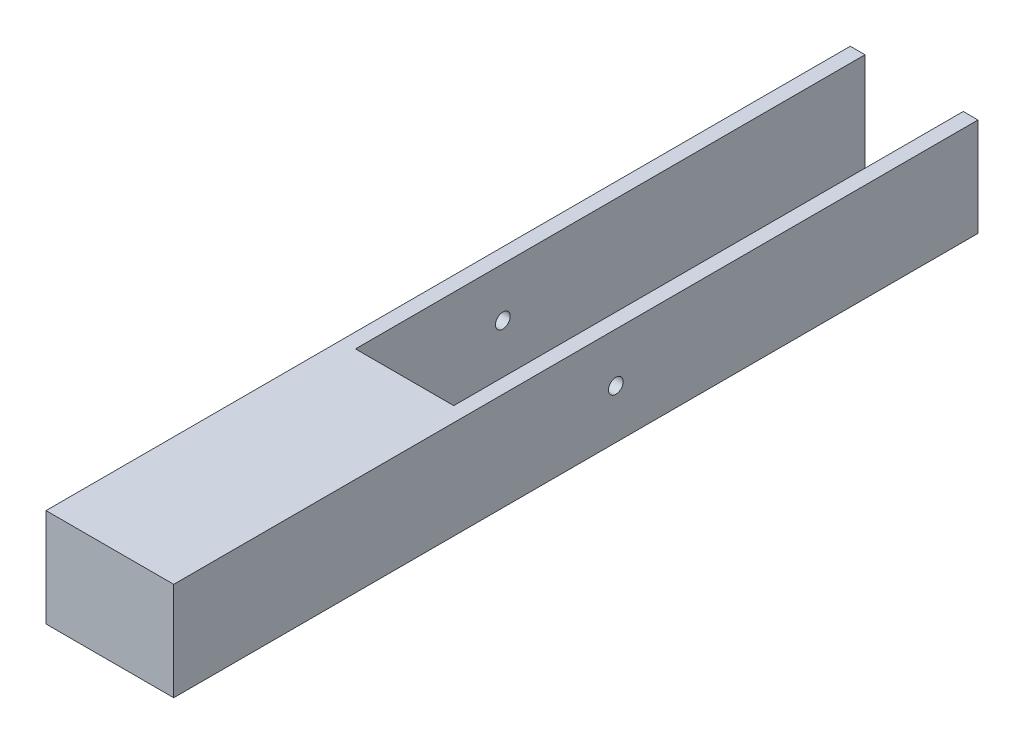
ISO-10303-21;
HEADER;
FILE_DESCRIPTION(('STEP AP214'),'2;1');
FILE_NAME('part.step','',(''),(''),'','','');
FILE_SCHEMA(('AUTOMOTIVE_DESIGN { 1 0 10303 214 1 1 1 1 }'));
ENDSEC;
DATA;
#1=APPLICATION_CONTEXT('core data for automotive mechanical design processes');
#2=APPLICATION_PROTOCOL_DEFINITION('international standard','automotive_design',2000,#1);
#3=PRODUCT_CONTEXT('',#1,'mechanical');
#4=PRODUCT('Part','Part','',(#3));
#5=PRODUCT_RELATED_PRODUCT_CATEGORY('part','',(#4));
#6=PRODUCT_DEFINITION_FORMATION('','',#4);
#7=PRODUCT_DEFINITION_CONTEXT('part definition',#1,'design');
#8=PRODUCT_DEFINITION('design','',#6,#7);
#9=PRODUCT_DEFINITION_SHAPE('','',#8);
#10=(LENGTH_UNIT() NAMED_UNIT(*) SI_UNIT(.MILLI.,.METRE.));
#11=(NAMED_UNIT(*) PLANE_ANGLE_UNIT() SI_UNIT($,.RADIAN.));
#12=(NAMED_UNIT(*) SI_UNIT($,.STERADIAN.) SOLID_ANGLE_UNIT());
#13=UNCERTAINTY_MEASURE_WITH_UNIT(LENGTH_MEASURE(1.E-05),#10,'distance_accuracy_value','');
#14=(GEOMETRIC_REPRESENTATION_CONTEXT(3) GLOBAL_UNCERTAINTY_ASSIGNED_CONTEXT((#13)) GLOBAL_UNIT_ASSIGNED_CONTEXT((#10,
#11,#12)) REPRESENTATION_CONTEXT('',''));
#15=CARTESIAN_POINT('',(0.,0.,0.));
#16=DIRECTION('',(0.,0.,1.));
#17=DIRECTION('',(1.,0.,0.));
#18=AXIS2_PLACEMENT_3D('',#15,#16,#17);
#19=CARTESIAN_POINT('',(0.,0.,76.2));
#20=DIRECTION('',(0.,1.,0.));
#21=DIRECTION('',(0.,0.,1.));
#22=AXIS2_PLACEMENT_3D('',#19,#20,#21);
#23=PLANE('',#22);
#24=DIRECTION('',(1.,0.,0.));
#25=VECTOR('',#24,1.);
#26=CARTESIAN_POINT('',(0.,0.,0.));
#27=LINE('',#26,#25);
#28=CARTESIAN_POINT('',(0.,0.,0.));
#29=VERTEX_POINT('',#28);
#30=CARTESIAN_POINT('',(25.4,0.,0.));
#31=VERTEX_POINT('',#30);
#32=EDGE_CURVE('E57',#29,#31,#27,.T.);
#33=ORIENTED_EDGE('',*,*,#32,.T.);
#34=DIRECTION('',(0.,0.,-1.));
#35=VECTOR('',#34,1.);
#36=CARTESIAN_POINT('',(25.4,0.,76.2));
#37=LINE('',#36,#35);
#38=CARTESIAN_POINT('',(25.4,0.,-131.724844479265));
#39=VERTEX_POINT('',#38);
#40=EDGE_CURVE('E151',#31,#39,#37,.T.);
#41=ORIENTED_EDGE('',*,*,#40,.T.);
#42=DIRECTION('',(-1.,0.,0.));
#43=VECTOR('',#42,1.);
#44=CARTESIAN_POINT('',(29.21,0.,-131.724844479265));
#45=LINE('',#44,#43);
#46=CARTESIAN_POINT('',(29.21,0.,-131.724844479265));
#47=VERTEX_POINT('',#46);
#48=EDGE_CURVE('E167',#47,#39,#45,.T.);
#49=ORIENTED_EDGE('',*,*,#48,.F.);
#50=DIRECTION('',(0.,0.,-1.));
#51=VECTOR('',#50,1.);
#52=CARTESIAN_POINT('',(29.21,0.,76.2));
#53=LINE('',#52,#51);
#54=CARTESIAN_POINT('',(29.21,0.,76.2));
#55=VERTEX_POINT('',#54);
#56=EDGE_CURVE('E138',#55,#47,#53,.T.);
#57=ORIENTED_EDGE('',*,*,#56,.F.);
#58=DIRECTION('',(1.,0.,0.));
#59=VECTOR('',#58,1.);
#60=CARTESIAN_POINT('',(0.,0.,76.2));
#61=LINE('',#60,#59);
#62=CARTESIAN_POINT('',(-3.81,0.,76.2));
#63=VERTEX_POINT('',#62);
#64=EDGE_CURVE('E41',#63,#55,#61,.T.);
#65=ORIENTED_EDGE('',*,*,#64,.F.);
#66=DIRECTION('',(0.,0.,1.));
#67=VECTOR('',#66,1.);
#68=CARTESIAN_POINT('',(-3.81,0.,76.2));
#69=LINE('',#68,#67);
#70=CARTESIAN_POINT('',(-3.81,0.,-131.724844479265));
#71=VERTEX_POINT('',#70);
#72=EDGE_CURVE('E118',#71,#63,#69,.T.);
#73=ORIENTED_EDGE('',*,*,#72,.F.);
#74=DIRECTION('',(1.,0.,0.));
#75=VECTOR('',#74,1.);
#76=CARTESIAN_POINT('',(-3.81,0.,-131.724844479265));
#77=LINE('',#76,#75);
#78=CARTESIAN_POINT('',(0.,0.,-131.724844479265));
#79=VERTEX_POINT('',#78);
#80=EDGE_CURVE('E129',#71,#79,#77,.T.);
#81=ORIENTED_EDGE('',*,*,#80,.T.);
#82=DIRECTION('',(0.,0.,1.));
#83=VECTOR('',#82,1.);
#84=CARTESIAN_POINT('',(0.,0.,76.2));
#85=LINE('',#84,#83);
#86=EDGE_CURVE('E119',#79,#29,#85,.T.);
#87=ORIENTED_EDGE('',*,*,#86,.T.);
#88=EDGE_LOOP('',(#33,#41,#49,#57,#65,#73,#81,#87));
#89=FACE_BOUND('',#88,.T.);
#90=ADVANCED_FACE('F32',(#89),#23,.F.);
#91=CARTESIAN_POINT('',(0.,25.4,76.2));
#92=DIRECTION('',(0.,-1.,0.));
#93=DIRECTION('',(0.,0.,-1.));
#94=AXIS2_PLACEMENT_3D('',#91,#92,#93);
#95=PLANE('',#94);
#96=DIRECTION('',(-1.,0.,0.));
#97=VECTOR('',#96,1.);
#98=CARTESIAN_POINT('',(0.,25.4,0.));
#99=LINE('',#98,#97);
#100=CARTESIAN_POINT('',(25.4,25.4,0.));
#101=VERTEX_POINT('',#100);
#102=CARTESIAN_POINT('',(0.,25.4,0.));
#103=VERTEX_POINT('',#102);
#104=EDGE_CURVE('E49',#101,#103,#99,.T.);
#105=ORIENTED_EDGE('',*,*,#104,.T.);
#106=DIRECTION('',(0.,0.,-1.));
#107=VECTOR('',#106,1.);
#108=CARTESIAN_POINT('',(0.,25.4,76.2));
#109=LINE('',#108,#107);
#110=CARTESIAN_POINT('',(0.,25.4,-131.724844479265));
#111=VERTEX_POINT('',#110);
#112=EDGE_CURVE('E134',#103,#111,#109,.T.);
#113=ORIENTED_EDGE('',*,*,#112,.T.);
#114=DIRECTION('',(1.,0.,0.));
#115=VECTOR('',#114,1.);
#116=CARTESIAN_POINT('',(-3.81,25.4,-131.724844479265));
#117=LINE('',#116,#115);
#118=CARTESIAN_POINT('',(-3.81,25.4,-131.724844479265));
#119=VERTEX_POINT('',#118);
#120=EDGE_CURVE('E110',#119,#111,#117,.T.);
#121=ORIENTED_EDGE('',*,*,#120,.F.);
#122=DIRECTION('',(0.,0.,-1.));
#123=VECTOR('',#122,1.);
#124=CARTESIAN_POINT('',(-3.81,25.4,76.2));
#125=LINE('',#124,#123);
#126=CARTESIAN_POINT('',(-3.81,25.4,76.2));
#127=VERTEX_POINT('',#126);
#128=EDGE_CURVE('E107',#127,#119,#125,.T.);
#129=ORIENTED_EDGE('',*,*,#128,.F.);
#130=DIRECTION('',(-1.,0.,0.));
#131=VECTOR('',#130,1.);
#132=CARTESIAN_POINT('',(0.,25.4,76.2));
#133=LINE('',#132,#131);
#134=CARTESIAN_POINT('',(29.21,25.4,76.2));
#135=VERTEX_POINT('',#134);
#136=EDGE_CURVE('E11',#135,#127,#133,.T.);
#137=ORIENTED_EDGE('',*,*,#136,.F.);
#138=DIRECTION('',(0.,0.,1.));
#139=VECTOR('',#138,1.);
#140=CARTESIAN_POINT('',(29.21,25.4,76.2));
#141=LINE('',#140,#139);
#142=CARTESIAN_POINT('',(29.21,25.4,-131.724844479265));
#143=VERTEX_POINT('',#142);
#144=EDGE_CURVE('E143',#143,#135,#141,.T.);
#145=ORIENTED_EDGE('',*,*,#144,.F.);
#146=DIRECTION('',(-1.,0.,0.));
#147=VECTOR('',#146,1.);
#148=CARTESIAN_POINT('',(29.21,25.4,-131.724844479265));
#149=LINE('',#148,#147);
#150=CARTESIAN_POINT('',(25.4,25.4,-131.724844479265));
#151=VERTEX_POINT('',#150);
#152=EDGE_CURVE('E145',#143,#151,#149,.T.);
#153=ORIENTED_EDGE('',*,*,#152,.T.);
#154=DIRECTION('',(0.,0.,1.));
#155=VECTOR('',#154,1.);
#156=CARTESIAN_POINT('',(25.4,25.4,76.2));
#157=LINE('',#156,#155);
#158=EDGE_CURVE('E139',#151,#101,#157,.T.);
#159=ORIENTED_EDGE('',*,*,#158,.T.);
#160=EDGE_LOOP('',(#105,#113,#121,#129,#137,#145,#153,#159));
#161=FACE_BOUND('',#160,.T.);
#162=ADVANCED_FACE('F108',(#161),#95,.F.);
#163=CARTESIAN_POINT('',(0.,0.,76.2));
#164=DIRECTION('',(0.,0.,-1.));
#165=DIRECTION('',(-1.,0.,0.));
#166=AXIS2_PLACEMENT_3D('',#163,#164,#165);
#167=PLANE('',#166);
#168=ORIENTED_EDGE('',*,*,#136,.T.);
#169=DIRECTION('',(0.,1.,0.));
#170=VECTOR('',#169,1.);
#171=CARTESIAN_POINT('',(-3.81,0.,76.2));
#172=LINE('',#171,#170);
#173=EDGE_CURVE('E101',#63,#127,#172,.T.);
#174=ORIENTED_EDGE('',*,*,#173,.F.);
#175=ORIENTED_EDGE('',*,*,#64,.T.);
#176=DIRECTION('',(0.,-1.,0.));
#177=VECTOR('',#176,1.);
#178=CARTESIAN_POINT('',(29.21,0.,76.2));
#179=LINE('',#178,#177);
#180=EDGE_CURVE('E103',#135,#55,#179,.T.);
#181=ORIENTED_EDGE('',*,*,#180,.F.);
#182=EDGE_LOOP('',(#168,#174,#175,#181));
#183=FACE_BOUND('',#182,.T.);
#184=ADVANCED_FACE('F99',(#183),#167,.F.);
#185=CARTESIAN_POINT('',(0.,0.,0.));
#186=DIRECTION('',(0.,0.,-1.));
#187=DIRECTION('',(-1.,0.,0.));
#188=AXIS2_PLACEMENT_3D('',#185,#186,#187);
#189=PLANE('',#188);
#190=DIRECTION('',(0.,-1.,0.));
#191=VECTOR('',#190,1.);
#192=CARTESIAN_POINT('',(0.,0.,0.));
#193=LINE('',#192,#191);
#194=EDGE_CURVE('E35',#103,#29,#193,.T.);
#195=ORIENTED_EDGE('',*,*,#194,.F.);
#196=ORIENTED_EDGE('',*,*,#104,.F.);
#197=DIRECTION('',(0.,1.,0.));
#198=VECTOR('',#197,1.);
#199=CARTESIAN_POINT('',(25.4,0.,0.));
#200=LINE('',#199,#198);
#201=EDGE_CURVE('E161',#31,#101,#200,.T.);
#202=ORIENTED_EDGE('',*,*,#201,.F.);
#203=ORIENTED_EDGE('',*,*,#32,.F.);
#204=EDGE_LOOP('',(#195,#196,#202,#203));
#205=FACE_BOUND('',#204,.T.);
#206=ADVANCED_FACE('F187',(#205),#189,.T.);
#207=CARTESIAN_POINT('',(29.21,0.,-131.724844479265));
#208=DIRECTION('',(0.,0.,1.));
#209=DIRECTION('',(1.,0.,0.));
#210=AXIS2_PLACEMENT_3D('',#207,#208,#209);
#211=PLANE('',#210);
#212=DIRECTION('',(0.,1.,0.));
#213=VECTOR('',#212,1.);
#214=CARTESIAN_POINT('',(25.4,0.,-131.724844479265));
#215=LINE('',#214,#213);
#216=EDGE_CURVE('E148',#39,#151,#215,.T.);
#217=ORIENTED_EDGE('',*,*,#216,.T.);
#218=ORIENTED_EDGE('',*,*,#152,.F.);
#219=DIRECTION('',(0.,1.,0.));
#220=VECTOR('',#219,1.);
#221=CARTESIAN_POINT('',(29.21,0.,-131.724844479265));
#222=LINE('',#221,#220);
#223=EDGE_CURVE('E141',#47,#143,#222,.T.);
#224=ORIENTED_EDGE('',*,*,#223,.F.);
#225=ORIENTED_EDGE('',*,*,#48,.T.);
#226=EDGE_LOOP('',(#217,#218,#224,#225));
#227=FACE_BOUND('',#226,.T.);
#228=ADVANCED_FACE('F184',(#227),#211,.F.);
#229=CARTESIAN_POINT('',(29.21,0.,0.));
#230=DIRECTION('',(-1.,0.,0.));
#231=DIRECTION('',(0.,0.,1.));
#232=AXIS2_PLACEMENT_3D('',#229,#230,#231);
#233=PLANE('',#232);
#234=CARTESIAN_POINT('',(29.21,12.7,-38.1));
#235=DIRECTION('',(-1.,0.,0.));
#236=DIRECTION('',(0.,0.,1.));
#237=AXIS2_PLACEMENT_3D('',#234,#235,#236);
#238=CIRCLE('',#237,1.905);
#239=CARTESIAN_POINT('',(29.21,12.7,-36.195));
#240=VERTEX_POINT('',#239);
#241=EDGE_CURVE('E277',#240,#240,#238,.T.);
#242=ORIENTED_EDGE('',*,*,#241,.T.);
#243=EDGE_LOOP('',(#242));
#244=FACE_BOUND('',#243,.T.);
#245=ORIENTED_EDGE('',*,*,#180,.T.);
#246=ORIENTED_EDGE('',*,*,#56,.T.);
#247=ORIENTED_EDGE('',*,*,#223,.T.);
#248=ORIENTED_EDGE('',*,*,#144,.T.);
#249=EDGE_LOOP('',(#245,#246,#247,#248));
#250=FACE_BOUND('',#249,.T.);
#251=ADVANCED_FACE('F186',(#244,#250),#233,.F.);
#252=CARTESIAN_POINT('',(25.4,0.,0.));
#253=DIRECTION('',(-1.,0.,0.));
#254=DIRECTION('',(0.,0.,1.));
#255=AXIS2_PLACEMENT_3D('',#252,#253,#254);
#256=PLANE('',#255);
#257=CARTESIAN_POINT('',(25.4,12.7,-38.1));
#258=DIRECTION('',(-1.,0.,0.));
#259=DIRECTION('',(0.,0.,1.));
#260=AXIS2_PLACEMENT_3D('',#257,#258,#259);
#261=CIRCLE('',#260,1.905);
#262=CARTESIAN_POINT('',(25.4,12.7,-36.195));
#263=VERTEX_POINT('',#262);
#264=EDGE_CURVE('E124',#263,#263,#261,.T.);
#265=ORIENTED_EDGE('',*,*,#264,.F.);
#266=EDGE_LOOP('',(#265));
#267=FACE_BOUND('',#266,.T.);
#268=ORIENTED_EDGE('',*,*,#40,.F.);
#269=ORIENTED_EDGE('',*,*,#201,.T.);
#270=ORIENTED_EDGE('',*,*,#158,.F.);
#271=ORIENTED_EDGE('',*,*,#216,.F.);
#272=EDGE_LOOP('',(#268,#269,#270,#271));
#273=FACE_BOUND('',#272,.T.);
#274=ADVANCED_FACE('F183',(#267,#273),#256,.T.);
#275=CARTESIAN_POINT('',(0.,0.,0.));
#276=DIRECTION('',(-1.,0.,0.));
#277=DIRECTION('',(0.,0.,1.));
#278=AXIS2_PLACEMENT_3D('',#275,#276,#277);
#279=PLANE('',#278);
#280=CARTESIAN_POINT('',(0.,12.7,-38.1));
#281=DIRECTION('',(-1.,0.,0.));
#282=DIRECTION('',(0.,0.,1.));
#283=AXIS2_PLACEMENT_3D('',#280,#281,#282);
#284=CIRCLE('',#283,1.905);
#285=CARTESIAN_POINT('',(0.,12.7,-36.195));
#286=VERTEX_POINT('',#285);
#287=EDGE_CURVE('E278',#286,#286,#284,.T.);
#288=ORIENTED_EDGE('',*,*,#287,.T.);
#289=EDGE_LOOP('',(#288));
#290=FACE_BOUND('',#289,.T.);
#291=ORIENTED_EDGE('',*,*,#112,.F.);
#292=ORIENTED_EDGE('',*,*,#194,.T.);
#293=ORIENTED_EDGE('',*,*,#86,.F.);
#294=DIRECTION('',(0.,-1.,0.));
#295=VECTOR('',#294,1.);
#296=CARTESIAN_POINT('',(0.,0.,-131.724844479265));
#297=LINE('',#296,#295);
#298=EDGE_CURVE('E121',#111,#79,#297,.T.);
#299=ORIENTED_EDGE('',*,*,#298,.F.);
#300=EDGE_LOOP('',(#291,#292,#293,#299));
#301=FACE_BOUND('',#300,.T.);
#302=ADVANCED_FACE('F224',(#290,#301),#279,.F.);
#303=CARTESIAN_POINT('',(-3.81,0.,-131.724844479265));
#304=DIRECTION('',(0.,0.,1.));
#305=DIRECTION('',(1.,0.,0.));
#306=AXIS2_PLACEMENT_3D('',#303,#304,#305);
#307=PLANE('',#306);
#308=ORIENTED_EDGE('',*,*,#298,.T.);
#309=ORIENTED_EDGE('',*,*,#80,.F.);
#310=DIRECTION('',(0.,-1.,0.));
#311=VECTOR('',#310,1.);
#312=CARTESIAN_POINT('',(-3.81,0.,-131.724844479265));
#313=LINE('',#312,#311);
#314=EDGE_CURVE('E113',#119,#71,#313,.T.);
#315=ORIENTED_EDGE('',*,*,#314,.F.);
#316=ORIENTED_EDGE('',*,*,#120,.T.);
#317=EDGE_LOOP('',(#308,#309,#315,#316));
#318=FACE_BOUND('',#317,.T.);
#319=ADVANCED_FACE('F220',(#318),#307,.F.);
#320=CARTESIAN_POINT('',(-3.81,0.,0.));
#321=DIRECTION('',(-1.,0.,0.));
#322=DIRECTION('',(0.,0.,1.));
#323=AXIS2_PLACEMENT_3D('',#320,#321,#322);
#324=PLANE('',#323);
#325=CARTESIAN_POINT('',(-3.81,12.7,-38.1));
#326=DIRECTION('',(-1.,0.,0.));
#327=DIRECTION('',(0.,0.,1.));
#328=AXIS2_PLACEMENT_3D('',#325,#326,#327);
#329=CIRCLE('',#328,1.905);
#330=CARTESIAN_POINT('',(-3.81,12.7,-36.195));
#331=VERTEX_POINT('',#330);
#332=EDGE_CURVE('E279',#331,#331,#329,.T.);
#333=ORIENTED_EDGE('',*,*,#332,.F.);
#334=EDGE_LOOP('',(#333));
#335=FACE_BOUND('',#334,.T.);
#336=ORIENTED_EDGE('',*,*,#173,.T.);
#337=ORIENTED_EDGE('',*,*,#128,.T.);
#338=ORIENTED_EDGE('',*,*,#314,.T.);
#339=ORIENTED_EDGE('',*,*,#72,.T.);
#340=EDGE_LOOP('',(#336,#337,#338,#339));
#341=FACE_BOUND('',#340,.T.);
#342=ADVANCED_FACE('F116',(#335,#341),#324,.T.);
#343=CARTESIAN_POINT('',(29.21,12.7,-38.1));
#344=DIRECTION('',(-1.,0.,0.));
#345=DIRECTION('',(0.,0.,1.));
#346=AXIS2_PLACEMENT_3D('',#343,#344,#345);
#347=CYLINDRICAL_SURFACE('',#346,1.905);
#348=ORIENTED_EDGE('',*,*,#332,.T.);
#349=EDGE_LOOP('',(#348));
#350=FACE_BOUND('',#349,.T.);
#351=ORIENTED_EDGE('',*,*,#287,.F.);
#352=EDGE_LOOP('',(#351));
#353=FACE_BOUND('',#352,.T.);
#354=ADVANCED_FACE('F251',(#350,#353),#347,.F.);
#355=ORIENTED_EDGE('',*,*,#264,.T.);
#356=EDGE_LOOP('',(#355));
#357=FACE_BOUND('',#356,.T.);
#358=ORIENTED_EDGE('',*,*,#241,.F.);
#359=EDGE_LOOP('',(#358));
#360=FACE_BOUND('',#359,.T.);
#361=ADVANCED_FACE('F259',(#357,#360),#347,.F.);
#362=CLOSED_SHELL('',(#90,#162,#184,#206,#228,#251,#274,#302,#319,#342,#354,#361));
#363=MANIFOLD_SOLID_BREP('B2',#362);
#364=ADVANCED_BREP_SHAPE_REPRESENTATION('',(#18,#363),#14);
#365=SHAPE_DEFINITION_REPRESENTATION(#9,#364);
ENDSEC;
END-ISO-10303-21;
